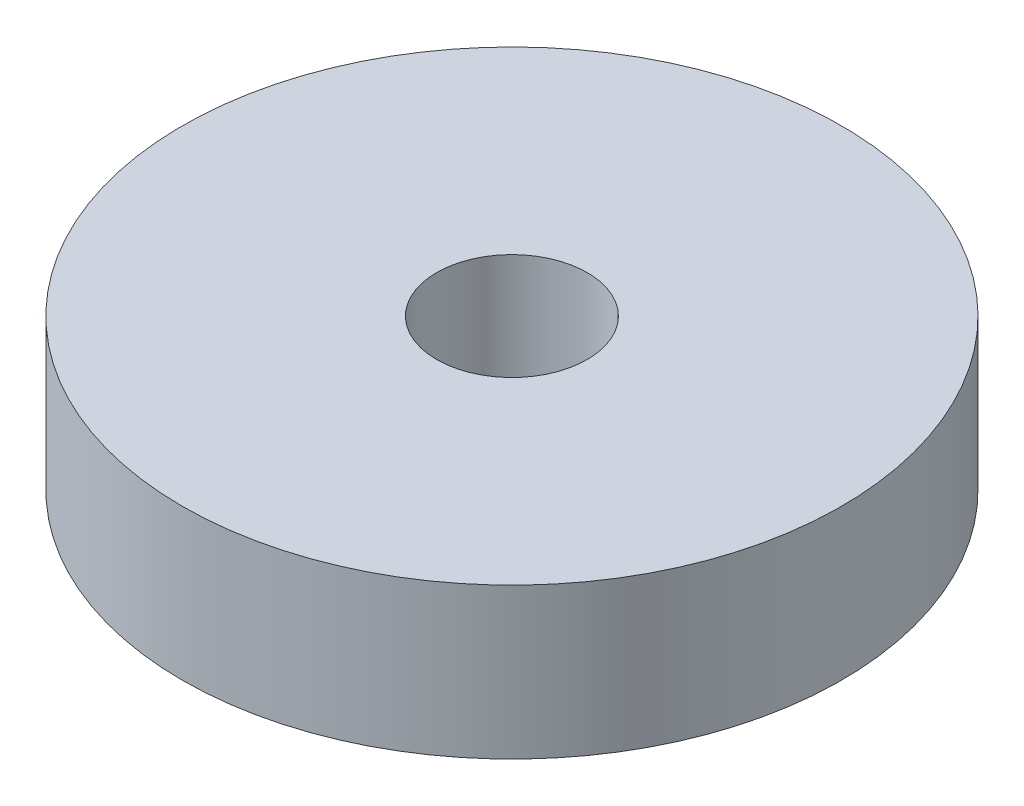
ISO-10303-21;
HEADER;
FILE_DESCRIPTION(('STEP AP214'),'2;1');
FILE_NAME('part.step','',(''),(''),'','','');
FILE_SCHEMA(('AUTOMOTIVE_DESIGN { 1 0 10303 214 1 1 1 1 }'));
ENDSEC;
DATA;
#1=APPLICATION_CONTEXT('core data for automotive mechanical design processes');
#2=APPLICATION_PROTOCOL_DEFINITION('international standard','automotive_design',2000,#1);
#3=PRODUCT_CONTEXT('',#1,'mechanical');
#4=PRODUCT('Part','Part','',(#3));
#5=PRODUCT_RELATED_PRODUCT_CATEGORY('part','',(#4));
#6=PRODUCT_DEFINITION_FORMATION('','',#4);
#7=PRODUCT_DEFINITION_CONTEXT('part definition',#1,'design');
#8=PRODUCT_DEFINITION('design','',#6,#7);
#9=PRODUCT_DEFINITION_SHAPE('','',#8);
#10=(LENGTH_UNIT() NAMED_UNIT(*) SI_UNIT(.MILLI.,.METRE.));
#11=(NAMED_UNIT(*) PLANE_ANGLE_UNIT() SI_UNIT($,.RADIAN.));
#12=(NAMED_UNIT(*) SI_UNIT($,.STERADIAN.) SOLID_ANGLE_UNIT());
#13=UNCERTAINTY_MEASURE_WITH_UNIT(LENGTH_MEASURE(1.E-05),#10,'distance_accuracy_value','');
#14=(GEOMETRIC_REPRESENTATION_CONTEXT(3) GLOBAL_UNCERTAINTY_ASSIGNED_CONTEXT((#13)) GLOBAL_UNIT_ASSIGNED_CONTEXT((#10,
#11,#12)) REPRESENTATION_CONTEXT('',''));
#15=CARTESIAN_POINT('',(0.,0.,0.));
#16=DIRECTION('',(0.,0.,1.));
#17=DIRECTION('',(1.,0.,0.));
#18=AXIS2_PLACEMENT_3D('',#15,#16,#17);
#19=CARTESIAN_POINT('',(0.,8.,0.));
#20=DIRECTION('',(0.,1.,0.));
#21=DIRECTION('',(0.,0.,1.));
#22=AXIS2_PLACEMENT_3D('',#19,#20,#21);
#23=PLANE('',#22);
#24=CARTESIAN_POINT('',(0.,8.,0.));
#25=DIRECTION('',(0.,1.,0.));
#26=DIRECTION('',(0.,0.,1.));
#27=AXIS2_PLACEMENT_3D('',#24,#25,#26);
#28=CIRCLE('',#27,17.5);
#29=CARTESIAN_POINT('',(0.,8.,17.5));
#30=VERTEX_POINT('',#29);
#31=EDGE_CURVE('E10',#30,#30,#28,.T.);
#32=ORIENTED_EDGE('',*,*,#31,.T.);
#33=EDGE_LOOP('',(#32));
#34=FACE_BOUND('',#33,.T.);
#35=CARTESIAN_POINT('',(0.,8.,0.));
#36=DIRECTION('',(0.,1.,0.));
#37=DIRECTION('',(0.,0.,1.));
#38=AXIS2_PLACEMENT_3D('',#35,#36,#37);
#39=CIRCLE('',#38,4.);
#40=CARTESIAN_POINT('',(0.,8.,4.));
#41=VERTEX_POINT('',#40);
#42=EDGE_CURVE('E50',#41,#41,#39,.T.);
#43=ORIENTED_EDGE('',*,*,#42,.F.);
#44=EDGE_LOOP('',(#43));
#45=FACE_BOUND('',#44,.T.);
#46=ADVANCED_FACE('F37',(#34,#45),#23,.T.);
#47=CARTESIAN_POINT('',(0.,0.,0.));
#48=DIRECTION('',(0.,1.,0.));
#49=DIRECTION('',(0.,0.,1.));
#50=AXIS2_PLACEMENT_3D('',#47,#48,#49);
#51=PLANE('',#50);
#52=CARTESIAN_POINT('',(0.,0.,0.));
#53=DIRECTION('',(0.,1.,0.));
#54=DIRECTION('',(0.,0.,1.));
#55=AXIS2_PLACEMENT_3D('',#52,#53,#54);
#56=CIRCLE('',#55,17.5);
#57=CARTESIAN_POINT('',(0.,0.,17.5));
#58=VERTEX_POINT('',#57);
#59=EDGE_CURVE('E41',#58,#58,#56,.T.);
#60=ORIENTED_EDGE('',*,*,#59,.F.);
#61=EDGE_LOOP('',(#60));
#62=FACE_BOUND('',#61,.T.);
#63=CARTESIAN_POINT('',(0.,0.,0.));
#64=DIRECTION('',(0.,1.,0.));
#65=DIRECTION('',(0.,0.,1.));
#66=AXIS2_PLACEMENT_3D('',#63,#64,#65);
#67=CIRCLE('',#66,4.);
#68=CARTESIAN_POINT('',(0.,0.,4.));
#69=VERTEX_POINT('',#68);
#70=EDGE_CURVE('E52',#69,#69,#67,.T.);
#71=ORIENTED_EDGE('',*,*,#70,.T.);
#72=EDGE_LOOP('',(#71));
#73=FACE_BOUND('',#72,.T.);
#74=ADVANCED_FACE('F64',(#62,#73),#51,.F.);
#75=CARTESIAN_POINT('',(0.,8.,0.));
#76=DIRECTION('',(0.,-1.,0.));
#77=DIRECTION('',(0.,0.,-1.));
#78=AXIS2_PLACEMENT_3D('',#75,#76,#77);
#79=CYLINDRICAL_SURFACE('',#78,17.5);
#80=ORIENTED_EDGE('',*,*,#31,.F.);
#81=EDGE_LOOP('',(#80));
#82=FACE_BOUND('',#81,.T.);
#83=ORIENTED_EDGE('',*,*,#59,.T.);
#84=EDGE_LOOP('',(#83));
#85=FACE_BOUND('',#84,.T.);
#86=ADVANCED_FACE('F39',(#82,#85),#79,.T.);
#87=CARTESIAN_POINT('',(0.,8.,0.));
#88=DIRECTION('',(0.,-1.,0.));
#89=DIRECTION('',(0.,0.,-1.));
#90=AXIS2_PLACEMENT_3D('',#87,#88,#89);
#91=CYLINDRICAL_SURFACE('',#90,4.);
#92=ORIENTED_EDGE('',*,*,#42,.T.);
#93=EDGE_LOOP('',(#92));
#94=FACE_BOUND('',#93,.T.);
#95=ORIENTED_EDGE('',*,*,#70,.F.);
#96=EDGE_LOOP('',(#95));
#97=FACE_BOUND('',#96,.T.);
#98=ADVANCED_FACE('F60',(#94,#97),#91,.F.);
#99=CLOSED_SHELL('',(#46,#74,#86,#98));
#100=MANIFOLD_SOLID_BREP('B2',#99);
#101=ADVANCED_BREP_SHAPE_REPRESENTATION('',(#18,#100),#14);
#102=SHAPE_DEFINITION_REPRESENTATION(#9,#101);
ENDSEC;
END-ISO-10303-21;
